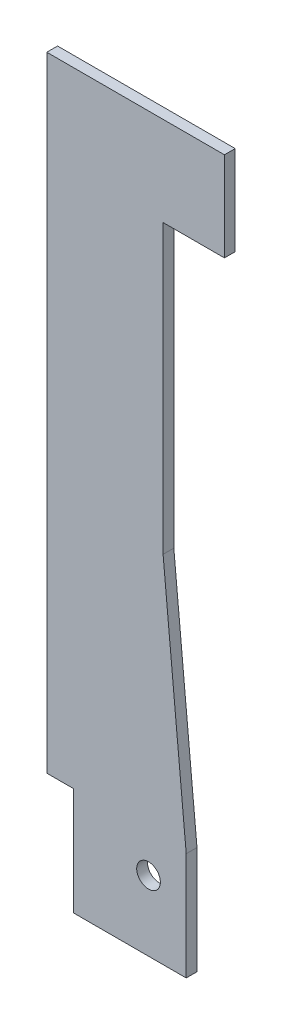
ISO-10303-21;
HEADER;
FILE_DESCRIPTION(('STEP AP214'),'2;1');
FILE_NAME('part.step','',(''),(''),'','','');
FILE_SCHEMA(('AUTOMOTIVE_DESIGN { 1 0 10303 214 1 1 1 1 }'));
ENDSEC;
DATA;
#1=APPLICATION_CONTEXT('core data for automotive mechanical design processes');
#2=APPLICATION_PROTOCOL_DEFINITION('international standard','automotive_design',2000,#1);
#3=PRODUCT_CONTEXT('',#1,'mechanical');
#4=PRODUCT('Part','Part','',(#3));
#5=PRODUCT_RELATED_PRODUCT_CATEGORY('part','',(#4));
#6=PRODUCT_DEFINITION_FORMATION('','',#4);
#7=PRODUCT_DEFINITION_CONTEXT('part definition',#1,'design');
#8=PRODUCT_DEFINITION('design','',#6,#7);
#9=PRODUCT_DEFINITION_SHAPE('','',#8);
#10=(LENGTH_UNIT() NAMED_UNIT(*) SI_UNIT(.MILLI.,.METRE.));
#11=(NAMED_UNIT(*) PLANE_ANGLE_UNIT() SI_UNIT($,.RADIAN.));
#12=(NAMED_UNIT(*) SI_UNIT($,.STERADIAN.) SOLID_ANGLE_UNIT());
#13=UNCERTAINTY_MEASURE_WITH_UNIT(LENGTH_MEASURE(1.E-05),#10,'distance_accuracy_value','');
#14=(GEOMETRIC_REPRESENTATION_CONTEXT(3) GLOBAL_UNCERTAINTY_ASSIGNED_CONTEXT((#13)) GLOBAL_UNIT_ASSIGNED_CONTEXT((#10,
#11,#12)) REPRESENTATION_CONTEXT('',''));
#15=CARTESIAN_POINT('',(0.,0.,0.));
#16=DIRECTION('',(0.,0.,1.));
#17=DIRECTION('',(1.,0.,0.));
#18=AXIS2_PLACEMENT_3D('',#15,#16,#17);
#19=CARTESIAN_POINT('',(0.,-40.2018274058339,1.));
#20=DIRECTION('',(0.,1.,0.));
#21=DIRECTION('',(0.,0.,1.));
#22=AXIS2_PLACEMENT_3D('',#19,#20,#21);
#23=PLANE('',#22);
#24=DIRECTION('',(1.,0.,0.));
#25=VECTOR('',#24,1.);
#26=CARTESIAN_POINT('',(0.,-40.2018274058339,1.));
#27=LINE('',#26,#25);
#28=CARTESIAN_POINT('',(-2.58880405856692,-40.2018274058339,1.));
#29=VERTEX_POINT('',#28);
#30=CARTESIAN_POINT('',(-0.0888040585669348,-40.2018274058339,1.));
#31=VERTEX_POINT('',#30);
#32=EDGE_CURVE('E66',#29,#31,#27,.T.);
#33=ORIENTED_EDGE('',*,*,#32,.F.);
#34=DIRECTION('',(0.,0.,1.));
#35=VECTOR('',#34,1.);
#36=CARTESIAN_POINT('',(-2.58880405856692,-40.2018274058339,-9.));
#37=LINE('',#36,#35);
#38=CARTESIAN_POINT('',(-2.58880405856692,-40.2018274058339,0.));
#39=VERTEX_POINT('',#38);
#40=EDGE_CURVE('E119',#39,#29,#37,.T.);
#41=ORIENTED_EDGE('',*,*,#40,.F.);
#42=DIRECTION('',(1.,0.,0.));
#43=VECTOR('',#42,1.);
#44=CARTESIAN_POINT('',(0.,-40.2018274058339,0.));
#45=LINE('',#44,#43);
#46=CARTESIAN_POINT('',(-0.0888040585669348,-40.2018274058339,0.));
#47=VERTEX_POINT('',#46);
#48=EDGE_CURVE('E162',#39,#47,#45,.T.);
#49=ORIENTED_EDGE('',*,*,#48,.T.);
#50=DIRECTION('',(0.,0.,-1.));
#51=VECTOR('',#50,1.);
#52=CARTESIAN_POINT('',(-0.0888040585669348,-40.2018274058339,1.));
#53=LINE('',#52,#51);
#54=EDGE_CURVE('E134',#31,#47,#53,.T.);
#55=ORIENTED_EDGE('',*,*,#54,.F.);
#56=EDGE_LOOP('',(#33,#41,#49,#55));
#57=FACE_BOUND('',#56,.T.);
#58=ADVANCED_FACE('F43',(#57),#23,.F.);
#59=CARTESIAN_POINT('',(0.,9.50000000000002,1.));
#60=DIRECTION('',(0.,-1.,0.));
#61=DIRECTION('',(0.,0.,-1.));
#62=AXIS2_PLACEMENT_3D('',#59,#60,#61);
#63=PLANE('',#62);
#64=DIRECTION('',(-1.,0.,0.));
#65=VECTOR('',#64,1.);
#66=CARTESIAN_POINT('',(0.,9.50000000000002,0.));
#67=LINE('',#66,#65);
#68=CARTESIAN_POINT('',(13.9111959414331,9.50000000000002,0.));
#69=VERTEX_POINT('',#68);
#70=CARTESIAN_POINT('',(8.21119594143307,9.50000000000002,0.));
#71=VERTEX_POINT('',#70);
#72=EDGE_CURVE('E151',#69,#71,#67,.T.);
#73=ORIENTED_EDGE('',*,*,#72,.F.);
#74=DIRECTION('',(0.,0.,-1.));
#75=VECTOR('',#74,1.);
#76=CARTESIAN_POINT('',(13.9111959414331,9.50000000000002,1.));
#77=LINE('',#76,#75);
#78=CARTESIAN_POINT('',(13.9111959414331,9.50000000000002,1.));
#79=VERTEX_POINT('',#78);
#80=EDGE_CURVE('E52',#79,#69,#77,.T.);
#81=ORIENTED_EDGE('',*,*,#80,.F.);
#82=DIRECTION('',(-1.,0.,0.));
#83=VECTOR('',#82,1.);
#84=CARTESIAN_POINT('',(0.,9.50000000000002,1.));
#85=LINE('',#84,#83);
#86=CARTESIAN_POINT('',(8.21119594143307,9.50000000000002,1.));
#87=VERTEX_POINT('',#86);
#88=EDGE_CURVE('E173',#79,#87,#85,.T.);
#89=ORIENTED_EDGE('',*,*,#88,.T.);
#90=DIRECTION('',(0.,0.,-1.));
#91=VECTOR('',#90,1.);
#92=CARTESIAN_POINT('',(8.21119594143307,9.50000000000002,1.));
#93=LINE('',#92,#91);
#94=EDGE_CURVE('E150',#87,#71,#93,.T.);
#95=ORIENTED_EDGE('',*,*,#94,.T.);
#96=EDGE_LOOP('',(#73,#81,#89,#95));
#97=FACE_BOUND('',#96,.T.);
#98=ADVANCED_FACE('F45',(#97),#63,.T.);
#99=CARTESIAN_POINT('',(13.9111959414331,0.,1.));
#100=DIRECTION('',(1.,0.,0.));
#101=DIRECTION('',(0.,0.,-1.));
#102=AXIS2_PLACEMENT_3D('',#99,#100,#101);
#103=PLANE('',#102);
#104=DIRECTION('',(0.,-1.,0.));
#105=VECTOR('',#104,1.);
#106=CARTESIAN_POINT('',(13.9111959414331,0.,0.));
#107=LINE('',#106,#105);
#108=CARTESIAN_POINT('',(13.9111959414331,17.7981725941661,0.));
#109=VERTEX_POINT('',#108);
#110=EDGE_CURVE('E155',#109,#69,#107,.T.);
#111=ORIENTED_EDGE('',*,*,#110,.F.);
#112=DIRECTION('',(0.,0.,-1.));
#113=VECTOR('',#112,1.);
#114=CARTESIAN_POINT('',(13.9111959414331,17.7981725941661,1.));
#115=LINE('',#114,#113);
#116=CARTESIAN_POINT('',(13.9111959414331,17.7981725941661,1.));
#117=VERTEX_POINT('',#116);
#118=EDGE_CURVE('E182',#117,#109,#115,.T.);
#119=ORIENTED_EDGE('',*,*,#118,.F.);
#120=DIRECTION('',(0.,-1.,0.));
#121=VECTOR('',#120,1.);
#122=CARTESIAN_POINT('',(13.9111959414331,0.,1.));
#123=LINE('',#122,#121);
#124=EDGE_CURVE('E143',#117,#79,#123,.T.);
#125=ORIENTED_EDGE('',*,*,#124,.T.);
#126=ORIENTED_EDGE('',*,*,#80,.T.);
#127=EDGE_LOOP('',(#111,#119,#125,#126));
#128=FACE_BOUND('',#127,.T.);
#129=ADVANCED_FACE('F190',(#128),#103,.T.);
#130=CARTESIAN_POINT('',(0.,17.7981725941661,1.));
#131=DIRECTION('',(0.,1.,0.));
#132=DIRECTION('',(0.,0.,1.));
#133=AXIS2_PLACEMENT_3D('',#130,#131,#132);
#134=PLANE('',#133);
#135=DIRECTION('',(0.,0.,1.));
#136=VECTOR('',#135,1.);
#137=CARTESIAN_POINT('',(-2.58880405856693,17.7981725941661,-9.));
#138=LINE('',#137,#136);
#139=CARTESIAN_POINT('',(-2.58880405856693,17.7981725941661,0.));
#140=VERTEX_POINT('',#139);
#141=CARTESIAN_POINT('',(-2.58880405856693,17.7981725941661,1.));
#142=VERTEX_POINT('',#141);
#143=EDGE_CURVE('E59',#140,#142,#138,.T.);
#144=ORIENTED_EDGE('',*,*,#143,.T.);
#145=DIRECTION('',(1.,0.,0.));
#146=VECTOR('',#145,1.);
#147=CARTESIAN_POINT('',(0.,17.7981725941661,1.));
#148=LINE('',#147,#146);
#149=EDGE_CURVE('E130',#142,#117,#148,.T.);
#150=ORIENTED_EDGE('',*,*,#149,.T.);
#151=ORIENTED_EDGE('',*,*,#118,.T.);
#152=DIRECTION('',(1.,0.,0.));
#153=VECTOR('',#152,1.);
#154=CARTESIAN_POINT('',(0.,17.7981725941661,0.));
#155=LINE('',#154,#153);
#156=EDGE_CURVE('E159',#140,#109,#155,.T.);
#157=ORIENTED_EDGE('',*,*,#156,.F.);
#158=EDGE_LOOP('',(#144,#150,#151,#157));
#159=FACE_BOUND('',#158,.T.);
#160=ADVANCED_FACE('F201',(#159),#134,.T.);
#161=CARTESIAN_POINT('',(6.54678338987438,0.611836942770042,1.));
#162=DIRECTION('',(-0.995661376967118,-0.093050644360705,0.));
#163=DIRECTION('',(0.093050644360705,-0.995661376967118,0.));
#164=AXIS2_PLACEMENT_3D('',#161,#162,#163);
#165=PLANE('',#164);
#166=DIRECTION('',(-0.093050644360705,0.995661376967118,0.));
#167=VECTOR('',#166,1.);
#168=CARTESIAN_POINT('',(6.54678338987438,0.611836942770042,0.));
#169=LINE('',#168,#167);
#170=CARTESIAN_POINT('',(10.3610699075732,-40.2018274058339,0.));
#171=VERTEX_POINT('',#170);
#172=CARTESIAN_POINT('',(8.21119594143307,-17.1977258422256,0.));
#173=VERTEX_POINT('',#172);
#174=EDGE_CURVE('E165',#171,#173,#169,.T.);
#175=ORIENTED_EDGE('',*,*,#174,.T.);
#176=DIRECTION('',(0.,0.,-1.));
#177=VECTOR('',#176,1.);
#178=CARTESIAN_POINT('',(8.21119594143307,-17.1977258422256,1.));
#179=LINE('',#178,#177);
#180=CARTESIAN_POINT('',(8.21119594143307,-17.1977258422256,1.));
#181=VERTEX_POINT('',#180);
#182=EDGE_CURVE('E176',#181,#173,#179,.T.);
#183=ORIENTED_EDGE('',*,*,#182,.F.);
#184=DIRECTION('',(-0.093050644360705,0.995661376967118,0.));
#185=VECTOR('',#184,1.);
#186=CARTESIAN_POINT('',(6.54678338987438,0.611836942770042,1.));
#187=LINE('',#186,#185);
#188=CARTESIAN_POINT('',(10.3610699075732,-40.2018274058339,1.));
#189=VERTEX_POINT('',#188);
#190=EDGE_CURVE('E137',#189,#181,#187,.T.);
#191=ORIENTED_EDGE('',*,*,#190,.F.);
#192=DIRECTION('',(0.,0.,-1.));
#193=VECTOR('',#192,1.);
#194=CARTESIAN_POINT('',(10.3610699075732,-40.2018274058339,1.));
#195=LINE('',#194,#193);
#196=EDGE_CURVE('E179',#189,#171,#195,.T.);
#197=ORIENTED_EDGE('',*,*,#196,.T.);
#198=EDGE_LOOP('',(#175,#183,#191,#197));
#199=FACE_BOUND('',#198,.T.);
#200=ADVANCED_FACE('F260',(#199),#165,.F.);
#201=CARTESIAN_POINT('',(8.21119594143307,0.,1.));
#202=DIRECTION('',(1.,0.,0.));
#203=DIRECTION('',(0.,1.,0.));
#204=AXIS2_PLACEMENT_3D('',#201,#202,#203);
#205=PLANE('',#204);
#206=DIRECTION('',(0.,-1.,0.));
#207=VECTOR('',#206,1.);
#208=CARTESIAN_POINT('',(8.21119594143307,0.,0.));
#209=LINE('',#208,#207);
#210=EDGE_CURVE('E169',#71,#173,#209,.T.);
#211=ORIENTED_EDGE('',*,*,#210,.F.);
#212=ORIENTED_EDGE('',*,*,#94,.F.);
#213=DIRECTION('',(0.,-1.,0.));
#214=VECTOR('',#213,1.);
#215=CARTESIAN_POINT('',(8.21119594143307,0.,1.));
#216=LINE('',#215,#214);
#217=EDGE_CURVE('E141',#87,#181,#216,.T.);
#218=ORIENTED_EDGE('',*,*,#217,.T.);
#219=ORIENTED_EDGE('',*,*,#182,.T.);
#220=EDGE_LOOP('',(#211,#212,#218,#219));
#221=FACE_BOUND('',#220,.T.);
#222=ADVANCED_FACE('F252',(#221),#205,.T.);
#223=CARTESIAN_POINT('',(0.,0.,1.));
#224=DIRECTION('',(0.,0.,1.));
#225=DIRECTION('',(1.,0.,0.));
#226=AXIS2_PLACEMENT_3D('',#223,#224,#225);
#227=PLANE('',#226);
#228=DIRECTION('',(0.,1.,0.));
#229=VECTOR('',#228,1.);
#230=CARTESIAN_POINT('',(-2.58880405856693,17.7981725941661,1.));
#231=LINE('',#230,#229);
#232=EDGE_CURVE('E121',#29,#142,#231,.T.);
#233=ORIENTED_EDGE('',*,*,#232,.F.);
#234=ORIENTED_EDGE('',*,*,#32,.T.);
#235=DIRECTION('',(0.,-1.,0.));
#236=VECTOR('',#235,1.);
#237=CARTESIAN_POINT('',(-0.0888040585669383,0.,1.));
#238=LINE('',#237,#236);
#239=CARTESIAN_POINT('',(-0.0888040585669339,-50.2018274058339,1.));
#240=VERTEX_POINT('',#239);
#241=EDGE_CURVE('E236',#31,#240,#238,.T.);
#242=ORIENTED_EDGE('',*,*,#241,.T.);
#243=DIRECTION('',(-1.,0.,0.));
#244=VECTOR('',#243,1.);
#245=CARTESIAN_POINT('',(0.,-50.2018274058339,1.));
#246=LINE('',#245,#244);
#247=CARTESIAN_POINT('',(10.3610699075732,-50.2018274058339,1.));
#248=VERTEX_POINT('',#247);
#249=EDGE_CURVE('E215',#248,#240,#246,.T.);
#250=ORIENTED_EDGE('',*,*,#249,.F.);
#251=DIRECTION('',(0.,-1.,0.));
#252=VECTOR('',#251,1.);
#253=CARTESIAN_POINT('',(10.3610699075732,0.,1.));
#254=LINE('',#253,#252);
#255=EDGE_CURVE('E239',#189,#248,#254,.T.);
#256=ORIENTED_EDGE('',*,*,#255,.F.);
#257=ORIENTED_EDGE('',*,*,#190,.T.);
#258=ORIENTED_EDGE('',*,*,#217,.F.);
#259=ORIENTED_EDGE('',*,*,#88,.F.);
#260=ORIENTED_EDGE('',*,*,#124,.F.);
#261=ORIENTED_EDGE('',*,*,#149,.F.);
#262=EDGE_LOOP('',(#233,#234,#242,#250,#256,#257,#258,#259,#260,#261));
#263=FACE_BOUND('',#262,.T.);
#264=CARTESIAN_POINT('',(6.86106990757321,-43.7018274058339,1.));
#265=DIRECTION('',(0.,0.,1.));
#266=DIRECTION('',(1.,0.,0.));
#267=AXIS2_PLACEMENT_3D('',#264,#265,#266);
#268=CIRCLE('',#267,1.1);
#269=CARTESIAN_POINT('',(7.96106990757321,-43.7018274058339,1.));
#270=VERTEX_POINT('',#269);
#271=EDGE_CURVE('E220',#270,#270,#268,.T.);
#272=ORIENTED_EDGE('',*,*,#271,.F.);
#273=EDGE_LOOP('',(#272));
#274=FACE_BOUND('',#273,.T.);
#275=ADVANCED_FACE('F127',(#263,#274),#227,.T.);
#276=CARTESIAN_POINT('',(0.,0.,0.));
#277=DIRECTION('',(0.,0.,1.));
#278=DIRECTION('',(1.,0.,0.));
#279=AXIS2_PLACEMENT_3D('',#276,#277,#278);
#280=PLANE('',#279);
#281=ORIENTED_EDGE('',*,*,#48,.F.);
#282=DIRECTION('',(0.,1.,0.));
#283=VECTOR('',#282,1.);
#284=CARTESIAN_POINT('',(-2.58880405856693,0.,0.));
#285=LINE('',#284,#283);
#286=EDGE_CURVE('E11',#39,#140,#285,.T.);
#287=ORIENTED_EDGE('',*,*,#286,.T.);
#288=ORIENTED_EDGE('',*,*,#156,.T.);
#289=ORIENTED_EDGE('',*,*,#110,.T.);
#290=ORIENTED_EDGE('',*,*,#72,.T.);
#291=ORIENTED_EDGE('',*,*,#210,.T.);
#292=ORIENTED_EDGE('',*,*,#174,.F.);
#293=DIRECTION('',(0.,-1.,0.));
#294=VECTOR('',#293,1.);
#295=CARTESIAN_POINT('',(10.3610699075732,0.,0.));
#296=LINE('',#295,#294);
#297=CARTESIAN_POINT('',(10.3610699075732,-50.2018274058339,0.));
#298=VERTEX_POINT('',#297);
#299=EDGE_CURVE('E225',#171,#298,#296,.T.);
#300=ORIENTED_EDGE('',*,*,#299,.T.);
#301=DIRECTION('',(-1.,0.,0.));
#302=VECTOR('',#301,1.);
#303=CARTESIAN_POINT('',(0.,-50.2018274058339,0.));
#304=LINE('',#303,#302);
#305=CARTESIAN_POINT('',(-0.0888040585669339,-50.2018274058339,0.));
#306=VERTEX_POINT('',#305);
#307=EDGE_CURVE('E216',#298,#306,#304,.T.);
#308=ORIENTED_EDGE('',*,*,#307,.T.);
#309=DIRECTION('',(0.,-1.,0.));
#310=VECTOR('',#309,1.);
#311=CARTESIAN_POINT('',(-0.0888040585669383,0.,0.));
#312=LINE('',#311,#310);
#313=EDGE_CURVE('E221',#47,#306,#312,.T.);
#314=ORIENTED_EDGE('',*,*,#313,.F.);
#315=EDGE_LOOP('',(#281,#287,#288,#289,#290,#291,#292,#300,#308,#314));
#316=FACE_BOUND('',#315,.T.);
#317=CARTESIAN_POINT('',(6.86106990757321,-43.7018274058339,0.));
#318=DIRECTION('',(0.,0.,1.));
#319=DIRECTION('',(1.,0.,0.));
#320=AXIS2_PLACEMENT_3D('',#317,#318,#319);
#321=CIRCLE('',#320,1.1);
#322=CARTESIAN_POINT('',(7.96106990757321,-43.7018274058339,0.));
#323=VERTEX_POINT('',#322);
#324=EDGE_CURVE('E229',#323,#323,#321,.T.);
#325=ORIENTED_EDGE('',*,*,#324,.T.);
#326=EDGE_LOOP('',(#325));
#327=FACE_BOUND('',#326,.T.);
#328=ADVANCED_FACE('F197',(#316,#327),#280,.F.);
#329=CARTESIAN_POINT('',(10.3610699075732,0.,1.));
#330=DIRECTION('',(1.,0.,0.));
#331=DIRECTION('',(0.,1.,0.));
#332=AXIS2_PLACEMENT_3D('',#329,#330,#331);
#333=PLANE('',#332);
#334=ORIENTED_EDGE('',*,*,#299,.F.);
#335=ORIENTED_EDGE('',*,*,#196,.F.);
#336=ORIENTED_EDGE('',*,*,#255,.T.);
#337=DIRECTION('',(0.,0.,-1.));
#338=VECTOR('',#337,1.);
#339=CARTESIAN_POINT('',(10.3610699075732,-50.2018274058339,1.));
#340=LINE('',#339,#338);
#341=EDGE_CURVE('E212',#248,#298,#340,.T.);
#342=ORIENTED_EDGE('',*,*,#341,.T.);
#343=EDGE_LOOP('',(#334,#335,#336,#342));
#344=FACE_BOUND('',#343,.T.);
#345=ADVANCED_FACE('F258',(#344),#333,.T.);
#346=CARTESIAN_POINT('',(-0.0888040585669383,0.,1.));
#347=DIRECTION('',(1.,0.,0.));
#348=DIRECTION('',(0.,1.,0.));
#349=AXIS2_PLACEMENT_3D('',#346,#347,#348);
#350=PLANE('',#349);
#351=ORIENTED_EDGE('',*,*,#313,.T.);
#352=DIRECTION('',(0.,0.,-1.));
#353=VECTOR('',#352,1.);
#354=CARTESIAN_POINT('',(-0.0888040585669339,-50.2018274058339,1.));
#355=LINE('',#354,#353);
#356=EDGE_CURVE('E209',#240,#306,#355,.T.);
#357=ORIENTED_EDGE('',*,*,#356,.F.);
#358=ORIENTED_EDGE('',*,*,#241,.F.);
#359=ORIENTED_EDGE('',*,*,#54,.T.);
#360=EDGE_LOOP('',(#351,#357,#358,#359));
#361=FACE_BOUND('',#360,.T.);
#362=ADVANCED_FACE('F352',(#361),#350,.F.);
#363=CARTESIAN_POINT('',(6.86106990757321,-43.7018274058339,1.));
#364=DIRECTION('',(0.,0.,-1.));
#365=DIRECTION('',(-1.,0.,0.));
#366=AXIS2_PLACEMENT_3D('',#363,#364,#365);
#367=CYLINDRICAL_SURFACE('',#366,1.1);
#368=ORIENTED_EDGE('',*,*,#271,.T.);
#369=EDGE_LOOP('',(#368));
#370=FACE_BOUND('',#369,.T.);
#371=ORIENTED_EDGE('',*,*,#324,.F.);
#372=EDGE_LOOP('',(#371));
#373=FACE_BOUND('',#372,.T.);
#374=ADVANCED_FACE('F249',(#370,#373),#367,.F.);
#375=CARTESIAN_POINT('',(0.,-50.2018274058339,1.));
#376=DIRECTION('',(0.,-1.,0.));
#377=DIRECTION('',(0.,0.,-1.));
#378=AXIS2_PLACEMENT_3D('',#375,#376,#377);
#379=PLANE('',#378);
#380=ORIENTED_EDGE('',*,*,#307,.F.);
#381=ORIENTED_EDGE('',*,*,#341,.F.);
#382=ORIENTED_EDGE('',*,*,#249,.T.);
#383=ORIENTED_EDGE('',*,*,#356,.T.);
#384=EDGE_LOOP('',(#380,#381,#382,#383));
#385=FACE_BOUND('',#384,.T.);
#386=ADVANCED_FACE('F335',(#385),#379,.T.);
#387=CARTESIAN_POINT('',(-2.58880405856693,17.7981725941661,-9.));
#388=DIRECTION('',(1.,0.,0.));
#389=DIRECTION('',(0.,1.,0.));
#390=AXIS2_PLACEMENT_3D('',#387,#388,#389);
#391=PLANE('',#390);
#392=ORIENTED_EDGE('',*,*,#40,.T.);
#393=ORIENTED_EDGE('',*,*,#232,.T.);
#394=ORIENTED_EDGE('',*,*,#143,.F.);
#395=ORIENTED_EDGE('',*,*,#286,.F.);
#396=EDGE_LOOP('',(#392,#393,#394,#395));
#397=FACE_BOUND('',#396,.T.);
#398=ADVANCED_FACE('F120',(#397),#391,.F.);
#399=CLOSED_SHELL('',(#58,#98,#129,#160,#200,#222,#275,#328,#345,#362,#374,#386,#398));
#400=MANIFOLD_SOLID_BREP('B2',#399);
#401=ADVANCED_BREP_SHAPE_REPRESENTATION('',(#18,#400),#14);
#402=SHAPE_DEFINITION_REPRESENTATION(#9,#401);
ENDSEC;
END-ISO-10303-21;
